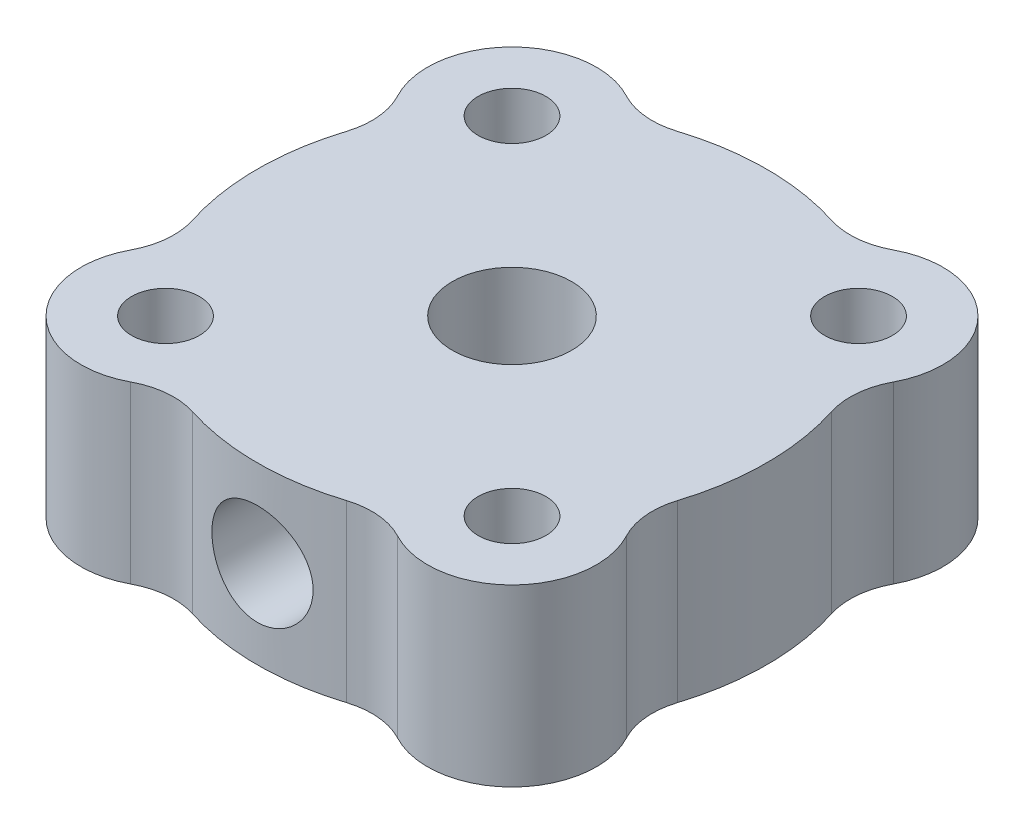
ISO-10303-21;
HEADER;
FILE_DESCRIPTION(('STEP AP214'),'2;1');
FILE_NAME('part.step','',(''),(''),'','','');
FILE_SCHEMA(('AUTOMOTIVE_DESIGN { 1 0 10303 214 1 1 1 1 }'));
ENDSEC;
DATA;
#1=APPLICATION_CONTEXT('core data for automotive mechanical design processes');
#2=APPLICATION_PROTOCOL_DEFINITION('international standard','automotive_design',2000,#1);
#3=PRODUCT_CONTEXT('',#1,'mechanical');
#4=PRODUCT('Part','Part','',(#3));
#5=PRODUCT_RELATED_PRODUCT_CATEGORY('part','',(#4));
#6=PRODUCT_DEFINITION_FORMATION('','',#4);
#7=PRODUCT_DEFINITION_CONTEXT('part definition',#1,'design');
#8=PRODUCT_DEFINITION('design','',#6,#7);
#9=PRODUCT_DEFINITION_SHAPE('','',#8);
#10=(LENGTH_UNIT() NAMED_UNIT(*) SI_UNIT(.MILLI.,.METRE.));
#11=(NAMED_UNIT(*) PLANE_ANGLE_UNIT() SI_UNIT($,.RADIAN.));
#12=(NAMED_UNIT(*) SI_UNIT($,.STERADIAN.) SOLID_ANGLE_UNIT());
#13=UNCERTAINTY_MEASURE_WITH_UNIT(LENGTH_MEASURE(1.E-05),#10,'distance_accuracy_value','');
#14=(GEOMETRIC_REPRESENTATION_CONTEXT(3) GLOBAL_UNCERTAINTY_ASSIGNED_CONTEXT((#13)) GLOBAL_UNIT_ASSIGNED_CONTEXT((#10,
#11,#12)) REPRESENTATION_CONTEXT('',''));
#15=CARTESIAN_POINT('',(0.,0.,0.));
#16=DIRECTION('',(0.,0.,1.));
#17=DIRECTION('',(1.,0.,0.));
#18=AXIS2_PLACEMENT_3D('',#15,#16,#17);
#19=CARTESIAN_POINT('',(0.,9.525,0.));
#20=DIRECTION('',(0.,-1.,0.));
#21=DIRECTION('',(0.,0.,-1.));
#22=AXIS2_PLACEMENT_3D('',#19,#20,#21);
#23=CYLINDRICAL_SURFACE('',#22,10.16);
#24=CARTESIAN_POINT('',(2.01929999999999,6.0325,9.95731025478267));
#25=CARTESIAN_POINT('',(2.01929583472054,6.14471648081074,9.95731248100948));
#26=CARTESIAN_POINT('',(2.00991409735292,6.25698558348416,9.95922785586349));
#27=CARTESIAN_POINT('',(1.97266569039373,6.47834882589701,9.96667132616414));
#28=CARTESIAN_POINT('',(1.94478413860136,6.58744033560093,9.97220233015554));
#29=CARTESIAN_POINT('',(1.87143393907439,6.79921376443675,9.98622645576942));
#30=CARTESIAN_POINT('',(1.82598266968648,6.90190190100549,9.99471664962022));
#31=CARTESIAN_POINT('',(1.71883064565229,7.09819202927756,10.0136990438493));
#32=CARTESIAN_POINT('',(1.65713083482633,7.19179454830025,10.0241911279352));
#33=CARTESIAN_POINT('',(1.51831456308946,7.3685688358573,10.0461588179763));
#34=CARTESIAN_POINT('',(1.44101465159409,7.4515952419108,10.0576450984735));
#35=CARTESIAN_POINT('',(1.27358880693613,7.60359171262718,10.0802129819397));
#36=CARTESIAN_POINT('',(1.1834619814265,7.67256079853317,10.0912945566865));
#37=CARTESIAN_POINT('',(0.991978888873635,7.79504818382441,10.1119194809288));
#38=CARTESIAN_POINT('',(0.890532687047899,7.84842845845371,10.1214487772059));
#39=CARTESIAN_POINT('',(0.679890278164236,7.93733244100311,10.1377755839567));
#40=CARTESIAN_POINT('',(0.570694788505186,7.97285779940727,10.144573346918));
#41=CARTESIAN_POINT('',(0.349161788437554,8.02459131793428,10.154595752293));
#42=CARTESIAN_POINT('',(0.236883675736461,8.04104489728259,10.1578657517424));
#43=CARTESIAN_POINT('',(0.0111162641446423,8.05493339468122,10.1606208068315));
#44=CARTESIAN_POINT('',(-0.102372918401157,8.05237012350486,10.1601062228371));
#45=CARTESIAN_POINT('',(-0.325654864980675,8.02848403665119,10.1553852675884));
#46=CARTESIAN_POINT('',(-0.435477167837939,8.00742556635269,10.1512309202276));
#47=CARTESIAN_POINT('',(-0.649997577271895,7.94756601948196,10.1397558615875));
#48=CARTESIAN_POINT('',(-0.754695480457813,7.90876423929733,10.1324350247414));
#49=CARTESIAN_POINT('',(-0.956750519015136,7.81427390243647,10.115363698157));
#50=CARTESIAN_POINT('',(-1.05405781450477,7.75848156506107,10.1055983441212));
#51=CARTESIAN_POINT('',(-1.23802703079321,7.63167061531241,10.0847148547401));
#52=CARTESIAN_POINT('',(-1.32468773944256,7.5606502717022,10.073596565645));
#53=CARTESIAN_POINT('',(-1.48647228733592,7.40394847765145,10.0510098074602));
#54=CARTESIAN_POINT('',(-1.56137184428112,7.31803568975991,10.0395386049798));
#55=CARTESIAN_POINT('',(-1.69573631850563,7.13475332435081,10.0177205902224));
#56=CARTESIAN_POINT('',(-1.75520095107537,7.03738353554782,10.0073737986882));
#57=CARTESIAN_POINT('',(-1.85708356820953,6.8336315693991,9.98897088276163));
#58=CARTESIAN_POINT('',(-1.89946562657724,6.72723096210058,9.98091959631615));
#59=CARTESIAN_POINT('',(-1.96568550088683,6.5086220273289,9.96809057436094));
#60=CARTESIAN_POINT('',(-1.98952570093373,6.39641444849336,9.96331241800282));
#61=CARTESIAN_POINT('',(-2.01765071256751,6.17140843575904,9.95765485692872));
#62=CARTESIAN_POINT('',(-2.02225923620202,6.05865204309633,9.95671092102642));
#63=CARTESIAN_POINT('',(-2.01266081032541,5.83398154987005,9.95865551443959));
#64=CARTESIAN_POINT('',(-1.99845491360724,5.72206740252961,9.96154382931495));
#65=CARTESIAN_POINT('',(-1.9519098538232,5.50334386399201,9.9707670861358));
#66=CARTESIAN_POINT('',(-1.91974332035685,5.39649622680081,9.97706919921533));
#67=CARTESIAN_POINT('',(-1.8383745157426,5.18970686678601,9.99238122747374));
#68=CARTESIAN_POINT('',(-1.78917085617849,5.08976570759246,10.0013913633312));
#69=CARTESIAN_POINT('',(-1.67439047681825,4.89820879855574,10.0212493996471));
#70=CARTESIAN_POINT('',(-1.60861100411642,4.80671688167348,10.0321194790247));
#71=CARTESIAN_POINT('',(-1.46281682517205,4.63595189402262,10.0544116075468));
#72=CARTESIAN_POINT('',(-1.38280067294784,4.55668006594381,10.0658337126731));
#73=CARTESIAN_POINT('',(-1.20935205961919,4.41137999346542,10.0881521334929));
#74=CARTESIAN_POINT('',(-1.1157347637329,4.34557050319768,10.0990378663506));
#75=CARTESIAN_POINT('',(-0.918584914987863,4.2306140237611,10.1188735848748));
#76=CARTESIAN_POINT('',(-0.815052775389772,4.1814663404987,10.1278236511712));
#77=CARTESIAN_POINT('',(-0.601590209450042,4.10154832702031,10.1427343861575));
#78=CARTESIAN_POINT('',(-0.491699699745443,4.07067464844154,10.1487118351069));
#79=CARTESIAN_POINT('',(-0.268161937832407,4.02785333570459,10.1570757707768));
#80=CARTESIAN_POINT('',(-0.154515133827768,4.01590345180838,10.1594626843532));
#81=CARTESIAN_POINT('',(0.071218868637973,4.01135516774449,10.160366680656));
#82=CARTESIAN_POINT('',(0.183299304290988,4.01842772547701,10.1589495647003));
#83=CARTESIAN_POINT('',(0.404640583995705,4.05099764153571,10.1525429134065));
#84=CARTESIAN_POINT('',(0.513901462580982,4.076494774089,10.147553421844));
#85=CARTESIAN_POINT('',(0.726300284646134,4.14504459279328,10.1345643086958));
#86=CARTESIAN_POINT('',(0.829451274843124,4.18805820414095,10.1265713900384));
#87=CARTESIAN_POINT('',(1.02711935747099,4.29037861536837,10.1084365292301));
#88=CARTESIAN_POINT('',(1.12163577727434,4.34968668313618,10.0982944198626));
#89=CARTESIAN_POINT('',(1.30097999243297,4.48402472973566,10.0767727481945));
#90=CARTESIAN_POINT('',(1.38562924278183,4.55929034816621,10.0653760311269));
#91=CARTESIAN_POINT('',(1.54120945598551,4.72292234556948,10.0427321652959));
#92=CARTESIAN_POINT('',(1.61213716788294,4.81129182041696,10.0314850525637));
#93=CARTESIAN_POINT('',(1.73897517405694,4.99974777416245,10.0102825040114));
#94=CARTESIAN_POINT('',(1.79471811460913,5.0999486430512,10.0003420421847));
#95=CARTESIAN_POINT('',(1.8884879094074,5.3084634845006,9.98306090497214));
#96=CARTESIAN_POINT('',(1.92653090182189,5.41676996163533,9.9757178628242));
#97=CARTESIAN_POINT('',(1.9764074815881,5.60985772686369,9.96593546165869));
#98=CARTESIAN_POINT('',(1.9924635204386,5.69353465815226,9.96272096935184));
#99=CARTESIAN_POINT('',(2.01391117975831,5.86229766646156,9.95840755723886));
#100=CARTESIAN_POINT('',(2.01930315936829,5.94738369592979,9.95730856618758));
#101=CARTESIAN_POINT('',(2.01929999999999,6.0325,9.95731025478267));
#102=B_SPLINE_CURVE_WITH_KNOTS('',3,(#24,#25,#26,#27,#28,#29,#30,#31,#32,#33,#34,#35,#36,#37,
#38,#39,#40,#41,#42,#43,#44,#45,#46,#47,#48,#49,#50,#51,#52,#53,#54,#55,#56,#57,#58,#59,#60,#61,
#62,#63,#64,#65,#66,#67,#68,#69,#70,#71,#72,#73,#74,#75,#76,#77,#78,#79,#80,#81,#82,#83,#84,#85,
#86,#87,#88,#89,#90,#91,#92,#93,#94,#95,#96,#97,#98,#99,#100,#101),.UNSPECIFIED.,.T.,.F.,(4,2,2,
2,2,2,2,2,2,2,2,2,2,2,2,2,2,2,2,2,2,2,2,2,2,2,2,2,2,2,2,2,2,2,2,2,2,2,4),(0.,0.336337808736557,
0.672946513450811,1.00922312424327,1.34548020622296,1.68594978664511,2.02644306455713,
2.36986554733131,2.7132562787593,3.05217734035293,3.39106613049666,3.72518871419504,
4.05932454870097,4.39554372167702,4.73180113892274,5.07384705743528,5.4158992848109,
5.75866717175792,6.10139097845218,6.43832211337239,6.77523439553347,7.10896282714314,
7.44271846187695,7.78077354311649,8.11886297933245,8.4620727237986,8.80526816915846,
9.14650365852408,9.4876985773743,9.82302977436588,10.1583568623126,10.4929399831352,
10.8275491455843,11.1674944347507,11.5075201666336,11.851154280325,12.1944744639631,
12.4495955937626,12.704708131528),.UNSPECIFIED.);
#103=CARTESIAN_POINT('',(2.01929999999999,6.0325,9.95731025478267));
#104=VERTEX_POINT('',#103);
#105=EDGE_CURVE('E328',#104,#104,#102,.T.);
#106=ORIENTED_EDGE('',*,*,#105,.F.);
#107=EDGE_LOOP('',(#106));
#108=FACE_BOUND('',#107,.T.);
#109=CARTESIAN_POINT('',(0.,2.54,0.));
#110=DIRECTION('',(0.,-1.,0.));
#111=DIRECTION('',(0.,0.,-1.));
#112=AXIS2_PLACEMENT_3D('',#109,#110,#111);
#113=CIRCLE('',#112,10.16);
#114=CARTESIAN_POINT('',(3.07207088405129,2.54,9.68441947064275));
#115=VERTEX_POINT('',#114);
#116=CARTESIAN_POINT('',(-3.0720708840515,2.54,9.68441947064268));
#117=VERTEX_POINT('',#116);
#118=EDGE_CURVE('E286',#115,#117,#113,.T.);
#119=ORIENTED_EDGE('',*,*,#118,.F.);
#120=DIRECTION('',(0.,-1.,0.));
#121=VECTOR('',#120,1.);
#122=CARTESIAN_POINT('',(3.07207088405129,9.525,9.68441947064275));
#123=LINE('',#122,#121);
#124=CARTESIAN_POINT('',(3.07207088405129,9.525,9.68441947064275));
#125=VERTEX_POINT('',#124);
#126=EDGE_CURVE('E190',#115,#125,#123,.F.);
#127=ORIENTED_EDGE('',*,*,#126,.T.);
#128=CARTESIAN_POINT('',(0.,9.525,0.));
#129=DIRECTION('',(0.,-1.,0.));
#130=DIRECTION('',(0.,0.,-1.));
#131=AXIS2_PLACEMENT_3D('',#128,#129,#130);
#132=CIRCLE('',#131,10.16);
#133=CARTESIAN_POINT('',(-3.0720708840515,9.525,9.68441947064268));
#134=VERTEX_POINT('',#133);
#135=EDGE_CURVE('E263',#125,#134,#132,.T.);
#136=ORIENTED_EDGE('',*,*,#135,.T.);
#137=DIRECTION('',(0.,-1.,0.));
#138=VECTOR('',#137,1.);
#139=CARTESIAN_POINT('',(-3.0720708840515,9.525,9.68441947064268));
#140=LINE('',#139,#138);
#141=EDGE_CURVE('E187',#134,#117,#140,.T.);
#142=ORIENTED_EDGE('',*,*,#141,.T.);
#143=EDGE_LOOP('',(#119,#127,#136,#142));
#144=FACE_BOUND('',#143,.T.);
#145=ADVANCED_FACE('F35',(#108,#144),#23,.T.);
#146=CARTESIAN_POINT('',(9.68441947064275,2.54,-3.07207088405128));
#147=VERTEX_POINT('',#146);
#148=CARTESIAN_POINT('',(9.68441947064269,2.54,3.07207088405146));
#149=VERTEX_POINT('',#148);
#150=EDGE_CURVE('E248',#147,#149,#113,.T.);
#151=ORIENTED_EDGE('',*,*,#150,.F.);
#152=DIRECTION('',(0.,-1.,0.));
#153=VECTOR('',#152,1.);
#154=CARTESIAN_POINT('',(9.68441947064275,9.525,-3.07207088405128));
#155=LINE('',#154,#153);
#156=CARTESIAN_POINT('',(9.68441947064275,9.525,-3.07207088405128));
#157=VERTEX_POINT('',#156);
#158=EDGE_CURVE('E185',#147,#157,#155,.F.);
#159=ORIENTED_EDGE('',*,*,#158,.T.);
#160=CARTESIAN_POINT('',(9.68441947064269,9.525,3.07207088405146));
#161=VERTEX_POINT('',#160);
#162=EDGE_CURVE('E261',#157,#161,#132,.T.);
#163=ORIENTED_EDGE('',*,*,#162,.T.);
#164=DIRECTION('',(0.,-1.,0.));
#165=VECTOR('',#164,1.);
#166=CARTESIAN_POINT('',(9.68441947064269,9.525,3.07207088405146));
#167=LINE('',#166,#165);
#168=EDGE_CURVE('E177',#161,#149,#167,.T.);
#169=ORIENTED_EDGE('',*,*,#168,.T.);
#170=EDGE_LOOP('',(#151,#159,#163,#169));
#171=FACE_BOUND('',#170,.T.);
#172=ADVANCED_FACE('F396',(#171),#23,.T.);
#173=CARTESIAN_POINT('',(-3.07207088405132,2.54,-9.68441947064274));
#174=VERTEX_POINT('',#173);
#175=CARTESIAN_POINT('',(3.07207088405138,2.54,-9.68441947064272));
#176=VERTEX_POINT('',#175);
#177=EDGE_CURVE('E155',#174,#176,#113,.T.);
#178=ORIENTED_EDGE('',*,*,#177,.F.);
#179=DIRECTION('',(0.,-1.,0.));
#180=VECTOR('',#179,1.);
#181=CARTESIAN_POINT('',(-3.07207088405132,9.525,-9.68441947064274));
#182=LINE('',#181,#180);
#183=CARTESIAN_POINT('',(-3.07207088405132,9.525,-9.68441947064274));
#184=VERTEX_POINT('',#183);
#185=EDGE_CURVE('E210',#174,#184,#182,.F.);
#186=ORIENTED_EDGE('',*,*,#185,.T.);
#187=CARTESIAN_POINT('',(3.07207088405138,9.525,-9.68441947064272));
#188=VERTEX_POINT('',#187);
#189=EDGE_CURVE('E259',#184,#188,#132,.T.);
#190=ORIENTED_EDGE('',*,*,#189,.T.);
#191=DIRECTION('',(0.,-1.,0.));
#192=VECTOR('',#191,1.);
#193=CARTESIAN_POINT('',(3.07207088405138,9.525,-9.68441947064272));
#194=LINE('',#193,#192);
#195=EDGE_CURVE('E208',#188,#176,#194,.T.);
#196=ORIENTED_EDGE('',*,*,#195,.T.);
#197=EDGE_LOOP('',(#178,#186,#190,#196));
#198=FACE_BOUND('',#197,.T.);
#199=ADVANCED_FACE('F272',(#198),#23,.T.);
#200=CARTESIAN_POINT('',(-9.68441947064275,9.525,3.07207088405127));
#201=VERTEX_POINT('',#200);
#202=CARTESIAN_POINT('',(-9.68441947064273,9.525,-3.07207088405135));
#203=VERTEX_POINT('',#202);
#204=EDGE_CURVE('E254',#201,#203,#132,.T.);
#205=ORIENTED_EDGE('',*,*,#204,.T.);
#206=DIRECTION('',(0.,-1.,0.));
#207=VECTOR('',#206,1.);
#208=CARTESIAN_POINT('',(-9.68441947064273,9.525,-3.07207088405135));
#209=LINE('',#208,#207);
#210=CARTESIAN_POINT('',(-9.68441947064273,2.54,-3.07207088405135));
#211=VERTEX_POINT('',#210);
#212=EDGE_CURVE('E213',#203,#211,#209,.T.);
#213=ORIENTED_EDGE('',*,*,#212,.T.);
#214=CARTESIAN_POINT('',(-9.68441947064275,2.54,3.07207088405127));
#215=VERTEX_POINT('',#214);
#216=EDGE_CURVE('E240',#215,#211,#113,.T.);
#217=ORIENTED_EDGE('',*,*,#216,.F.);
#218=DIRECTION('',(0.,-1.,0.));
#219=VECTOR('',#218,1.);
#220=CARTESIAN_POINT('',(-9.68441947064276,9.525,3.07207088405127));
#221=LINE('',#220,#219);
#222=EDGE_CURVE('E57',#215,#201,#221,.F.);
#223=ORIENTED_EDGE('',*,*,#222,.T.);
#224=EDGE_LOOP('',(#205,#213,#217,#223));
#225=FACE_BOUND('',#224,.T.);
#226=ADVANCED_FACE('F245',(#225),#23,.T.);
#227=CARTESIAN_POINT('',(-6.91479721322333,9.525,6.91479721322316));
#228=DIRECTION('',(0.,-1.,0.));
#229=DIRECTION('',(0.,0.,-1.));
#230=AXIS2_PLACEMENT_3D('',#227,#228,#229);
#231=CYLINDRICAL_SURFACE('',#230,3.37220278677669);
#232=CARTESIAN_POINT('',(-6.91479721322333,2.54,6.91479721322316));
#233=DIRECTION('',(0.,-1.,0.));
#234=DIRECTION('',(0.,0.,-1.));
#235=AXIS2_PLACEMENT_3D('',#232,#233,#234);
#236=CIRCLE('',#235,3.37220278677669);
#237=CARTESIAN_POINT('',(-5.32895061805783,2.54,9.89084193932296));
#238=VERTEX_POINT('',#237);
#239=CARTESIAN_POINT('',(-9.89084193932309,2.54,5.32895061805759));
#240=VERTEX_POINT('',#239);
#241=EDGE_CURVE('E242',#238,#240,#236,.T.);
#242=ORIENTED_EDGE('',*,*,#241,.F.);
#243=DIRECTION('',(0.,-1.,0.));
#244=VECTOR('',#243,1.);
#245=CARTESIAN_POINT('',(-5.32895061805783,9.525,9.89084193932296));
#246=LINE('',#245,#244);
#247=CARTESIAN_POINT('',(-5.32895061805783,9.525,9.89084193932296));
#248=VERTEX_POINT('',#247);
#249=EDGE_CURVE('E201',#238,#248,#246,.F.);
#250=ORIENTED_EDGE('',*,*,#249,.T.);
#251=CARTESIAN_POINT('',(-6.91479721322333,9.525,6.91479721322316));
#252=DIRECTION('',(0.,-1.,0.));
#253=DIRECTION('',(0.,0.,-1.));
#254=AXIS2_PLACEMENT_3D('',#251,#252,#253);
#255=CIRCLE('',#254,3.37220278677669);
#256=CARTESIAN_POINT('',(-9.89084193932309,9.525,5.32895061805759));
#257=VERTEX_POINT('',#256);
#258=EDGE_CURVE('E180',#248,#257,#255,.T.);
#259=ORIENTED_EDGE('',*,*,#258,.T.);
#260=DIRECTION('',(0.,-1.,0.));
#261=VECTOR('',#260,1.);
#262=CARTESIAN_POINT('',(-9.89084193932309,9.525,5.32895061805759));
#263=LINE('',#262,#261);
#264=EDGE_CURVE('E198',#257,#240,#263,.T.);
#265=ORIENTED_EDGE('',*,*,#264,.T.);
#266=EDGE_LOOP('',(#242,#250,#259,#265));
#267=FACE_BOUND('',#266,.T.);
#268=ADVANCED_FACE('F256',(#267),#231,.T.);
#269=CARTESIAN_POINT('',(-3.45739860661167,9.525,3.45739860661158));
#270=DIRECTION('',(0.,-1.,0.));
#271=DIRECTION('',(0.,0.,-1.));
#272=AXIS2_PLACEMENT_3D('',#269,#270,#271);
#273=PLANE('',#272);
#274=CARTESIAN_POINT('',(0.,9.52500000000001,0.));
#275=DIRECTION('',(0.,-1.,0.));
#276=DIRECTION('',(0.,0.,-1.));
#277=AXIS2_PLACEMENT_3D('',#274,#275,#276);
#278=CIRCLE('',#277,2.38124999999998);
#279=CARTESIAN_POINT('',(0.,9.52500000000001,-2.38124999999998));
#280=VERTEX_POINT('',#279);
#281=EDGE_CURVE('E322',#280,#280,#278,.T.);
#282=ORIENTED_EDGE('',*,*,#281,.T.);
#283=EDGE_LOOP('',(#282));
#284=FACE_BOUND('',#283,.T.);
#285=CARTESIAN_POINT('',(6.91479721322318,9.52500000000001,-6.91479721322331));
#286=DIRECTION('',(0.,-1.,0.));
#287=DIRECTION('',(0.,0.,-1.));
#288=AXIS2_PLACEMENT_3D('',#285,#286,#287);
#289=CIRCLE('',#288,1.35254999999998);
#290=CARTESIAN_POINT('',(6.91479721322318,9.52500000000001,-8.26734721322329));
#291=VERTEX_POINT('',#290);
#292=EDGE_CURVE('E316',#291,#291,#289,.T.);
#293=ORIENTED_EDGE('',*,*,#292,.T.);
#294=EDGE_LOOP('',(#293));
#295=FACE_BOUND('',#294,.T.);
#296=CARTESIAN_POINT('',(6.91479721322324,9.52500000000001,6.91479721322326));
#297=DIRECTION('',(0.,-1.,0.));
#298=DIRECTION('',(0.,0.,-1.));
#299=AXIS2_PLACEMENT_3D('',#296,#297,#298);
#300=CIRCLE('',#299,1.35254999999998);
#301=CARTESIAN_POINT('',(6.91479721322324,9.52500000000001,5.56224721322328));
#302=VERTEX_POINT('',#301);
#303=EDGE_CURVE('E310',#302,#302,#300,.T.);
#304=ORIENTED_EDGE('',*,*,#303,.T.);
#305=EDGE_LOOP('',(#304));
#306=FACE_BOUND('',#305,.T.);
#307=CARTESIAN_POINT('',(-6.91479721322323,9.52500000000001,6.91479721322326));
#308=DIRECTION('',(0.,-1.,0.));
#309=DIRECTION('',(0.,0.,-1.));
#310=AXIS2_PLACEMENT_3D('',#307,#308,#309);
#311=CIRCLE('',#310,1.35254999999998);
#312=CARTESIAN_POINT('',(-6.91479721322323,9.52500000000001,5.56224721322328));
#313=VERTEX_POINT('',#312);
#314=EDGE_CURVE('E304',#313,#313,#311,.T.);
#315=ORIENTED_EDGE('',*,*,#314,.T.);
#316=EDGE_LOOP('',(#315));
#317=FACE_BOUND('',#316,.T.);
#318=CARTESIAN_POINT('',(-6.91479721322324,9.52500000000001,-6.91479721322326));
#319=DIRECTION('',(0.,-1.,0.));
#320=DIRECTION('',(0.,0.,-1.));
#321=AXIS2_PLACEMENT_3D('',#318,#319,#320);
#322=CIRCLE('',#321,1.35254999999998);
#323=CARTESIAN_POINT('',(-6.91479721322324,9.52500000000001,-8.26734721322324));
#324=VERTEX_POINT('',#323);
#325=EDGE_CURVE('E298',#324,#324,#322,.T.);
#326=ORIENTED_EDGE('',*,*,#325,.T.);
#327=EDGE_LOOP('',(#326));
#328=FACE_BOUND('',#327,.T.);
#329=ORIENTED_EDGE('',*,*,#204,.F.);
#330=CARTESIAN_POINT('',(-12.4686900684525,9.525,3.95529126321601));
#331=DIRECTION('',(0.,-1.,0.));
#332=DIRECTION('',(0.,0.,-1.));
#333=AXIS2_PLACEMENT_3D('',#330,#331,#332);
#334=CIRCLE('',#333,2.921);
#335=EDGE_CURVE('E11',#201,#257,#334,.T.);
#336=ORIENTED_EDGE('',*,*,#335,.T.);
#337=ORIENTED_EDGE('',*,*,#258,.F.);
#338=CARTESIAN_POINT('',(-3.95529126321631,9.525,12.4686900684524));
#339=DIRECTION('',(0.,-1.,0.));
#340=DIRECTION('',(0.,0.,-1.));
#341=AXIS2_PLACEMENT_3D('',#338,#339,#340);
#342=CIRCLE('',#341,2.921);
#343=EDGE_CURVE('E226',#248,#134,#342,.T.);
#344=ORIENTED_EDGE('',*,*,#343,.T.);
#345=ORIENTED_EDGE('',*,*,#135,.F.);
#346=CARTESIAN_POINT('',(3.95529126321603,9.525,12.4686900684525));
#347=DIRECTION('',(0.,-1.,0.));
#348=DIRECTION('',(0.,0.,-1.));
#349=AXIS2_PLACEMENT_3D('',#346,#347,#348);
#350=CIRCLE('',#349,2.921);
#351=CARTESIAN_POINT('',(5.32895061805761,9.525,9.89084193932309));
#352=VERTEX_POINT('',#351);
#353=EDGE_CURVE('E220',#125,#352,#350,.T.);
#354=ORIENTED_EDGE('',*,*,#353,.T.);
#355=CARTESIAN_POINT('',(6.91479721322319,9.525,6.91479721322331));
#356=DIRECTION('',(0.,1.,0.));
#357=DIRECTION('',(0.,0.,1.));
#358=AXIS2_PLACEMENT_3D('',#355,#356,#357);
#359=CIRCLE('',#358,3.3722027867767);
#360=CARTESIAN_POINT('',(9.89084193932299,9.525,5.32895061805778));
#361=VERTEX_POINT('',#360);
#362=EDGE_CURVE('E290',#352,#361,#359,.T.);
#363=ORIENTED_EDGE('',*,*,#362,.T.);
#364=CARTESIAN_POINT('',(12.4686900684525,9.525,3.95529126321625));
#365=DIRECTION('',(0.,-1.,0.));
#366=DIRECTION('',(0.,0.,-1.));
#367=AXIS2_PLACEMENT_3D('',#364,#365,#366);
#368=CIRCLE('',#367,2.921);
#369=EDGE_CURVE('E232',#361,#161,#368,.T.);
#370=ORIENTED_EDGE('',*,*,#369,.T.);
#371=ORIENTED_EDGE('',*,*,#162,.F.);
#372=CARTESIAN_POINT('',(12.4686900684525,9.525,-3.95529126321603));
#373=DIRECTION('',(0.,-1.,0.));
#374=DIRECTION('',(0.,0.,-1.));
#375=AXIS2_PLACEMENT_3D('',#372,#373,#374);
#376=CIRCLE('',#375,2.921);
#377=CARTESIAN_POINT('',(9.89084193932309,9.525,-5.32895061805761));
#378=VERTEX_POINT('',#377);
#379=EDGE_CURVE('E218',#157,#378,#376,.T.);
#380=ORIENTED_EDGE('',*,*,#379,.T.);
#381=CARTESIAN_POINT('',(6.91479721322328,9.525,-6.91479721322321));
#382=DIRECTION('',(0.,-1.,0.));
#383=DIRECTION('',(0.,0.,-1.));
#384=AXIS2_PLACEMENT_3D('',#381,#382,#383);
#385=CIRCLE('',#384,3.37220278677674);
#386=CARTESIAN_POINT('',(5.32895061805771,9.525,-9.89084193932303));
#387=VERTEX_POINT('',#386);
#388=EDGE_CURVE('E170',#387,#378,#385,.T.);
#389=ORIENTED_EDGE('',*,*,#388,.F.);
#390=CARTESIAN_POINT('',(3.95529126321616,9.525,-12.4686900684525));
#391=DIRECTION('',(0.,-1.,0.));
#392=DIRECTION('',(0.,0.,-1.));
#393=AXIS2_PLACEMENT_3D('',#390,#391,#392);
#394=CIRCLE('',#393,2.921);
#395=EDGE_CURVE('E160',#387,#188,#394,.T.);
#396=ORIENTED_EDGE('',*,*,#395,.T.);
#397=ORIENTED_EDGE('',*,*,#189,.F.);
#398=CARTESIAN_POINT('',(-3.95529126321607,9.525,-12.4686900684525));
#399=DIRECTION('',(0.,-1.,0.));
#400=DIRECTION('',(0.,0.,-1.));
#401=AXIS2_PLACEMENT_3D('',#398,#399,#400);
#402=CIRCLE('',#401,2.921);
#403=CARTESIAN_POINT('',(-5.32895061805764,9.525,-9.89084193932307));
#404=VERTEX_POINT('',#403);
#405=EDGE_CURVE('E230',#184,#404,#402,.T.);
#406=ORIENTED_EDGE('',*,*,#405,.T.);
#407=CARTESIAN_POINT('',(-6.91479721322324,9.525,-6.91479721322326));
#408=DIRECTION('',(0.,-1.,0.));
#409=DIRECTION('',(0.,0.,-1.));
#410=AXIS2_PLACEMENT_3D('',#407,#408,#409);
#411=CIRCLE('',#410,3.37220278677674);
#412=CARTESIAN_POINT('',(-9.89084193932305,9.525,-5.32895061805768));
#413=VERTEX_POINT('',#412);
#414=EDGE_CURVE('E285',#413,#404,#411,.T.);
#415=ORIENTED_EDGE('',*,*,#414,.F.);
#416=CARTESIAN_POINT('',(-12.4686900684525,9.525,-3.95529126321611));
#417=DIRECTION('',(0.,-1.,0.));
#418=DIRECTION('',(0.,0.,-1.));
#419=AXIS2_PLACEMENT_3D('',#416,#417,#418);
#420=CIRCLE('',#419,2.921);
#421=EDGE_CURVE('E50',#413,#203,#420,.T.);
#422=ORIENTED_EDGE('',*,*,#421,.T.);
#423=EDGE_LOOP('',(#329,#336,#337,#344,#345,#354,#363,#370,#371,#380,#389,#396,#397,#406,#415,#422));
#424=FACE_BOUND('',#423,.T.);
#425=ADVANCED_FACE('F252',(#284,#295,#306,#317,#328,#424),#273,.F.);
#426=CARTESIAN_POINT('',(-3.45739860661167,2.54,3.45739860661158));
#427=DIRECTION('',(0.,-1.,0.));
#428=DIRECTION('',(0.,0.,-1.));
#429=AXIS2_PLACEMENT_3D('',#426,#427,#428);
#430=PLANE('',#429);
#431=CARTESIAN_POINT('',(6.91479721322318,2.54,-6.91479721322331));
#432=DIRECTION('',(0.,-1.,0.));
#433=DIRECTION('',(0.,0.,-1.));
#434=AXIS2_PLACEMENT_3D('',#431,#432,#433);
#435=CIRCLE('',#434,1.35254999999998);
#436=CARTESIAN_POINT('',(6.91479721322318,2.54,-8.26734721322329));
#437=VERTEX_POINT('',#436);
#438=EDGE_CURVE('E319',#437,#437,#435,.T.);
#439=ORIENTED_EDGE('',*,*,#438,.F.);
#440=EDGE_LOOP('',(#439));
#441=FACE_BOUND('',#440,.T.);
#442=CARTESIAN_POINT('',(6.91479721322324,2.54,6.91479721322326));
#443=DIRECTION('',(0.,-1.,0.));
#444=DIRECTION('',(0.,0.,-1.));
#445=AXIS2_PLACEMENT_3D('',#442,#443,#444);
#446=CIRCLE('',#445,1.35254999999998);
#447=CARTESIAN_POINT('',(6.91479721322324,2.54,5.56224721322328));
#448=VERTEX_POINT('',#447);
#449=EDGE_CURVE('E313',#448,#448,#446,.T.);
#450=ORIENTED_EDGE('',*,*,#449,.F.);
#451=EDGE_LOOP('',(#450));
#452=FACE_BOUND('',#451,.T.);
#453=CARTESIAN_POINT('',(-6.91479721322323,2.54,6.91479721322326));
#454=DIRECTION('',(0.,-1.,0.));
#455=DIRECTION('',(0.,0.,-1.));
#456=AXIS2_PLACEMENT_3D('',#453,#454,#455);
#457=CIRCLE('',#456,1.35254999999998);
#458=CARTESIAN_POINT('',(-6.91479721322323,2.54,5.56224721322328));
#459=VERTEX_POINT('',#458);
#460=EDGE_CURVE('E307',#459,#459,#457,.T.);
#461=ORIENTED_EDGE('',*,*,#460,.F.);
#462=EDGE_LOOP('',(#461));
#463=FACE_BOUND('',#462,.T.);
#464=CARTESIAN_POINT('',(-6.91479721322324,2.54,-6.91479721322326));
#465=DIRECTION('',(0.,-1.,0.));
#466=DIRECTION('',(0.,0.,-1.));
#467=AXIS2_PLACEMENT_3D('',#464,#465,#466);
#468=CIRCLE('',#467,1.35254999999998);
#469=CARTESIAN_POINT('',(-6.91479721322324,2.54,-8.26734721322324));
#470=VERTEX_POINT('',#469);
#471=EDGE_CURVE('E301',#470,#470,#468,.T.);
#472=ORIENTED_EDGE('',*,*,#471,.F.);
#473=EDGE_LOOP('',(#472));
#474=FACE_BOUND('',#473,.T.);
#475=CARTESIAN_POINT('',(0.,2.54,0.));
#476=DIRECTION('',(0.,-1.,0.));
#477=DIRECTION('',(0.,0.,-1.));
#478=AXIS2_PLACEMENT_3D('',#475,#476,#477);
#479=CIRCLE('',#478,6.35);
#480=CARTESIAN_POINT('',(0.,2.54,-6.35));
#481=VERTEX_POINT('',#480);
#482=EDGE_CURVE('E175',#481,#481,#479,.T.);
#483=ORIENTED_EDGE('',*,*,#482,.F.);
#484=EDGE_LOOP('',(#483));
#485=FACE_BOUND('',#484,.T.);
#486=ORIENTED_EDGE('',*,*,#241,.T.);
#487=CARTESIAN_POINT('',(-12.4686900684525,2.54,3.95529126321601));
#488=DIRECTION('',(0.,-1.,0.));
#489=DIRECTION('',(0.,0.,-1.));
#490=AXIS2_PLACEMENT_3D('',#487,#488,#489);
#491=CIRCLE('',#490,2.921);
#492=EDGE_CURVE('E43',#240,#215,#491,.F.);
#493=ORIENTED_EDGE('',*,*,#492,.T.);
#494=ORIENTED_EDGE('',*,*,#216,.T.);
#495=CARTESIAN_POINT('',(-12.4686900684525,2.54,-3.95529126321611));
#496=DIRECTION('',(0.,-1.,0.));
#497=DIRECTION('',(0.,0.,-1.));
#498=AXIS2_PLACEMENT_3D('',#495,#496,#497);
#499=CIRCLE('',#498,2.921);
#500=CARTESIAN_POINT('',(-9.89084193932305,2.54,-5.32895061805768));
#501=VERTEX_POINT('',#500);
#502=EDGE_CURVE('E236',#211,#501,#499,.F.);
#503=ORIENTED_EDGE('',*,*,#502,.T.);
#504=CARTESIAN_POINT('',(-6.91479721322324,2.54,-6.91479721322326));
#505=DIRECTION('',(0.,-1.,0.));
#506=DIRECTION('',(0.,0.,-1.));
#507=AXIS2_PLACEMENT_3D('',#504,#505,#506);
#508=CIRCLE('',#507,3.37220278677674);
#509=CARTESIAN_POINT('',(-5.32895061805764,2.54,-9.89084193932307));
#510=VERTEX_POINT('',#509);
#511=EDGE_CURVE('E283',#501,#510,#508,.T.);
#512=ORIENTED_EDGE('',*,*,#511,.T.);
#513=CARTESIAN_POINT('',(-3.95529126321607,2.54,-12.4686900684525));
#514=DIRECTION('',(0.,-1.,0.));
#515=DIRECTION('',(0.,0.,-1.));
#516=AXIS2_PLACEMENT_3D('',#513,#514,#515);
#517=CIRCLE('',#516,2.921);
#518=EDGE_CURVE('E228',#510,#174,#517,.F.);
#519=ORIENTED_EDGE('',*,*,#518,.T.);
#520=ORIENTED_EDGE('',*,*,#177,.T.);
#521=CARTESIAN_POINT('',(3.95529126321616,2.54,-12.4686900684525));
#522=DIRECTION('',(0.,-1.,0.));
#523=DIRECTION('',(0.,0.,-1.));
#524=AXIS2_PLACEMENT_3D('',#521,#522,#523);
#525=CIRCLE('',#524,2.921);
#526=CARTESIAN_POINT('',(5.32895061805771,2.54,-9.89084193932303));
#527=VERTEX_POINT('',#526);
#528=EDGE_CURVE('E149',#176,#527,#525,.F.);
#529=ORIENTED_EDGE('',*,*,#528,.T.);
#530=CARTESIAN_POINT('',(6.91479721322328,2.54,-6.91479721322321));
#531=DIRECTION('',(0.,-1.,0.));
#532=DIRECTION('',(0.,0.,-1.));
#533=AXIS2_PLACEMENT_3D('',#530,#531,#532);
#534=CIRCLE('',#533,3.37220278677674);
#535=CARTESIAN_POINT('',(9.89084193932309,2.54,-5.32895061805761));
#536=VERTEX_POINT('',#535);
#537=EDGE_CURVE('E153',#527,#536,#534,.T.);
#538=ORIENTED_EDGE('',*,*,#537,.T.);
#539=CARTESIAN_POINT('',(12.4686900684525,2.54,-3.95529126321603));
#540=DIRECTION('',(0.,-1.,0.));
#541=DIRECTION('',(0.,0.,-1.));
#542=AXIS2_PLACEMENT_3D('',#539,#540,#541);
#543=CIRCLE('',#542,2.921);
#544=EDGE_CURVE('E216',#536,#147,#543,.F.);
#545=ORIENTED_EDGE('',*,*,#544,.T.);
#546=ORIENTED_EDGE('',*,*,#150,.T.);
#547=CARTESIAN_POINT('',(12.4686900684525,2.54,3.95529126321625));
#548=DIRECTION('',(0.,-1.,0.));
#549=DIRECTION('',(0.,0.,-1.));
#550=AXIS2_PLACEMENT_3D('',#547,#548,#549);
#551=CIRCLE('',#550,2.921);
#552=CARTESIAN_POINT('',(9.89084193932299,2.54,5.32895061805778));
#553=VERTEX_POINT('',#552);
#554=EDGE_CURVE('E234',#149,#553,#551,.F.);
#555=ORIENTED_EDGE('',*,*,#554,.T.);
#556=CARTESIAN_POINT('',(6.91479721322319,2.54,6.91479721322331));
#557=DIRECTION('',(0.,1.,0.));
#558=DIRECTION('',(0.,0.,1.));
#559=AXIS2_PLACEMENT_3D('',#556,#557,#558);
#560=CIRCLE('',#559,3.3722027867767);
#561=CARTESIAN_POINT('',(5.32895061805761,2.54,9.89084193932309));
#562=VERTEX_POINT('',#561);
#563=EDGE_CURVE('E171',#562,#553,#560,.T.);
#564=ORIENTED_EDGE('',*,*,#563,.F.);
#565=CARTESIAN_POINT('',(3.95529126321603,2.54,12.4686900684525));
#566=DIRECTION('',(0.,-1.,0.));
#567=DIRECTION('',(0.,0.,-1.));
#568=AXIS2_PLACEMENT_3D('',#565,#566,#567);
#569=CIRCLE('',#568,2.921);
#570=EDGE_CURVE('E222',#562,#115,#569,.F.);
#571=ORIENTED_EDGE('',*,*,#570,.T.);
#572=ORIENTED_EDGE('',*,*,#118,.T.);
#573=CARTESIAN_POINT('',(-3.95529126321631,2.54,12.4686900684524));
#574=DIRECTION('',(0.,-1.,0.));
#575=DIRECTION('',(0.,0.,-1.));
#576=AXIS2_PLACEMENT_3D('',#573,#574,#575);
#577=CIRCLE('',#576,2.921);
#578=EDGE_CURVE('E224',#117,#238,#577,.F.);
#579=ORIENTED_EDGE('',*,*,#578,.T.);
#580=EDGE_LOOP('',(#486,#493,#494,#503,#512,#519,#520,#529,#538,#545,#546,#555,#564,#571,#572,#579));
#581=FACE_BOUND('',#580,.T.);
#582=ADVANCED_FACE('F152',(#441,#452,#463,#474,#485,#581),#430,.T.);
#583=CARTESIAN_POINT('',(-6.91479721322324,9.525,-6.91479721322326));
#584=DIRECTION('',(0.,-1.,0.));
#585=DIRECTION('',(0.,0.,-1.));
#586=AXIS2_PLACEMENT_3D('',#583,#584,#585);
#587=CYLINDRICAL_SURFACE('',#586,3.37220278677674);
#588=ORIENTED_EDGE('',*,*,#414,.T.);
#589=DIRECTION('',(0.,-1.,0.));
#590=VECTOR('',#589,1.);
#591=CARTESIAN_POINT('',(-5.32895061805764,9.525,-9.89084193932307));
#592=LINE('',#591,#590);
#593=EDGE_CURVE('E205',#404,#510,#592,.T.);
#594=ORIENTED_EDGE('',*,*,#593,.T.);
#595=ORIENTED_EDGE('',*,*,#511,.F.);
#596=DIRECTION('',(0.,-1.,0.));
#597=VECTOR('',#596,1.);
#598=CARTESIAN_POINT('',(-9.89084193932305,9.525,-5.32895061805768));
#599=LINE('',#598,#597);
#600=EDGE_CURVE('E203',#501,#413,#599,.F.);
#601=ORIENTED_EDGE('',*,*,#600,.T.);
#602=EDGE_LOOP('',(#588,#594,#595,#601));
#603=FACE_BOUND('',#602,.T.);
#604=ADVANCED_FACE('F282',(#603),#587,.T.);
#605=CARTESIAN_POINT('',(6.91479721322328,9.525,-6.91479721322321));
#606=DIRECTION('',(0.,-1.,0.));
#607=DIRECTION('',(0.,0.,-1.));
#608=AXIS2_PLACEMENT_3D('',#605,#606,#607);
#609=CYLINDRICAL_SURFACE('',#608,3.37220278677674);
#610=ORIENTED_EDGE('',*,*,#388,.T.);
#611=DIRECTION('',(0.,-1.,0.));
#612=VECTOR('',#611,1.);
#613=CARTESIAN_POINT('',(9.89084193932309,9.525,-5.32895061805761));
#614=LINE('',#613,#612);
#615=EDGE_CURVE('E169',#378,#536,#614,.T.);
#616=ORIENTED_EDGE('',*,*,#615,.T.);
#617=ORIENTED_EDGE('',*,*,#537,.F.);
#618=DIRECTION('',(0.,-1.,0.));
#619=VECTOR('',#618,1.);
#620=CARTESIAN_POINT('',(5.32895061805771,9.525,-9.89084193932303));
#621=LINE('',#620,#619);
#622=EDGE_CURVE('E166',#527,#387,#621,.F.);
#623=ORIENTED_EDGE('',*,*,#622,.T.);
#624=EDGE_LOOP('',(#610,#616,#617,#623));
#625=FACE_BOUND('',#624,.T.);
#626=ADVANCED_FACE('F165',(#625),#609,.T.);
#627=CARTESIAN_POINT('',(6.91479721322319,2.54,6.91479721322331));
#628=DIRECTION('',(0.,1.,0.));
#629=DIRECTION('',(0.,0.,1.));
#630=AXIS2_PLACEMENT_3D('',#627,#628,#629);
#631=CYLINDRICAL_SURFACE('',#630,3.3722027867767);
#632=ORIENTED_EDGE('',*,*,#362,.F.);
#633=DIRECTION('',(0.,1.,0.));
#634=VECTOR('',#633,1.);
#635=CARTESIAN_POINT('',(5.32895061805761,2.54,9.89084193932309));
#636=LINE('',#635,#634);
#637=EDGE_CURVE('E196',#352,#562,#636,.F.);
#638=ORIENTED_EDGE('',*,*,#637,.T.);
#639=ORIENTED_EDGE('',*,*,#563,.T.);
#640=DIRECTION('',(0.,1.,0.));
#641=VECTOR('',#640,1.);
#642=CARTESIAN_POINT('',(9.89084193932299,2.54,5.32895061805778));
#643=LINE('',#642,#641);
#644=EDGE_CURVE('E193',#553,#361,#643,.T.);
#645=ORIENTED_EDGE('',*,*,#644,.T.);
#646=EDGE_LOOP('',(#632,#638,#639,#645));
#647=FACE_BOUND('',#646,.T.);
#648=ADVANCED_FACE('F377',(#647),#631,.T.);
#649=CARTESIAN_POINT('',(0.,2.54,0.));
#650=DIRECTION('',(0.,-1.,0.));
#651=DIRECTION('',(0.,0.,-1.));
#652=AXIS2_PLACEMENT_3D('',#649,#650,#651);
#653=CYLINDRICAL_SURFACE('',#652,6.35);
#654=ORIENTED_EDGE('',*,*,#482,.T.);
#655=EDGE_LOOP('',(#654));
#656=FACE_BOUND('',#655,.T.);
#657=CARTESIAN_POINT('',(0.,0.,0.));
#658=DIRECTION('',(0.,-1.,0.));
#659=DIRECTION('',(0.,0.,-1.));
#660=AXIS2_PLACEMENT_3D('',#657,#658,#659);
#661=CIRCLE('',#660,6.35);
#662=CARTESIAN_POINT('',(0.,0.,-6.35));
#663=VERTEX_POINT('',#662);
#664=EDGE_CURVE('E293',#663,#663,#661,.T.);
#665=ORIENTED_EDGE('',*,*,#664,.F.);
#666=EDGE_LOOP('',(#665));
#667=FACE_BOUND('',#666,.T.);
#668=ADVANCED_FACE('F373',(#656,#667),#653,.T.);
#669=CARTESIAN_POINT('',(0.,0.,0.));
#670=DIRECTION('',(0.,-1.,0.));
#671=DIRECTION('',(0.,0.,-1.));
#672=AXIS2_PLACEMENT_3D('',#669,#670,#671);
#673=PLANE('',#672);
#674=CARTESIAN_POINT('',(0.,0.,0.));
#675=DIRECTION('',(0.,-1.,0.));
#676=DIRECTION('',(0.,0.,-1.));
#677=AXIS2_PLACEMENT_3D('',#674,#675,#676);
#678=CIRCLE('',#677,2.38124999999999);
#679=CARTESIAN_POINT('',(0.,0.,-2.38124999999999));
#680=VERTEX_POINT('',#679);
#681=EDGE_CURVE('E325',#680,#680,#678,.T.);
#682=ORIENTED_EDGE('',*,*,#681,.F.);
#683=EDGE_LOOP('',(#682));
#684=FACE_BOUND('',#683,.T.);
#685=ORIENTED_EDGE('',*,*,#664,.T.);
#686=EDGE_LOOP('',(#685));
#687=FACE_BOUND('',#686,.T.);
#688=ADVANCED_FACE('F369',(#684,#687),#673,.T.);
#689=CARTESIAN_POINT('',(-6.91479721322324,2.54,-6.91479721322326));
#690=DIRECTION('',(0.,-1.,0.));
#691=DIRECTION('',(0.,0.,-1.));
#692=AXIS2_PLACEMENT_3D('',#689,#690,#691);
#693=CYLINDRICAL_SURFACE('',#692,1.35254999999998);
#694=ORIENTED_EDGE('',*,*,#325,.F.);
#695=EDGE_LOOP('',(#694));
#696=FACE_BOUND('',#695,.T.);
#697=ORIENTED_EDGE('',*,*,#471,.T.);
#698=EDGE_LOOP('',(#697));
#699=FACE_BOUND('',#698,.T.);
#700=ADVANCED_FACE('F365',(#696,#699),#693,.F.);
#701=CARTESIAN_POINT('',(-6.91479721322323,2.54,6.91479721322326));
#702=DIRECTION('',(0.,-1.,0.));
#703=DIRECTION('',(0.,0.,-1.));
#704=AXIS2_PLACEMENT_3D('',#701,#702,#703);
#705=CYLINDRICAL_SURFACE('',#704,1.35254999999998);
#706=ORIENTED_EDGE('',*,*,#314,.F.);
#707=EDGE_LOOP('',(#706));
#708=FACE_BOUND('',#707,.T.);
#709=ORIENTED_EDGE('',*,*,#460,.T.);
#710=EDGE_LOOP('',(#709));
#711=FACE_BOUND('',#710,.T.);
#712=ADVANCED_FACE('F361',(#708,#711),#705,.F.);
#713=CARTESIAN_POINT('',(6.91479721322324,2.54,6.91479721322326));
#714=DIRECTION('',(0.,-1.,0.));
#715=DIRECTION('',(0.,0.,-1.));
#716=AXIS2_PLACEMENT_3D('',#713,#714,#715);
#717=CYLINDRICAL_SURFACE('',#716,1.35254999999998);
#718=ORIENTED_EDGE('',*,*,#303,.F.);
#719=EDGE_LOOP('',(#718));
#720=FACE_BOUND('',#719,.T.);
#721=ORIENTED_EDGE('',*,*,#449,.T.);
#722=EDGE_LOOP('',(#721));
#723=FACE_BOUND('',#722,.T.);
#724=ADVANCED_FACE('F357',(#720,#723),#717,.F.);
#725=CARTESIAN_POINT('',(6.91479721322318,2.54,-6.91479721322331));
#726=DIRECTION('',(0.,-1.,0.));
#727=DIRECTION('',(0.,0.,-1.));
#728=AXIS2_PLACEMENT_3D('',#725,#726,#727);
#729=CYLINDRICAL_SURFACE('',#728,1.35254999999998);
#730=ORIENTED_EDGE('',*,*,#292,.F.);
#731=EDGE_LOOP('',(#730));
#732=FACE_BOUND('',#731,.T.);
#733=ORIENTED_EDGE('',*,*,#438,.T.);
#734=EDGE_LOOP('',(#733));
#735=FACE_BOUND('',#734,.T.);
#736=ADVANCED_FACE('F353',(#732,#735),#729,.F.);
#737=CARTESIAN_POINT('',(0.,0.,0.));
#738=DIRECTION('',(0.,-1.,0.));
#739=DIRECTION('',(0.,0.,-1.));
#740=AXIS2_PLACEMENT_3D('',#737,#738,#739);
#741=CYLINDRICAL_SURFACE('',#740,2.38124999999998);
#742=CARTESIAN_POINT('',(2.01929999999999,6.0325,1.26205351411894));
#743=CARTESIAN_POINT('',(2.01929069614341,6.10167682715141,1.26207834818193));
#744=CARTESIAN_POINT('',(2.01569819232827,6.17096296972695,1.26787264236478));
#745=CARTESIAN_POINT('',(2.0017074615824,6.30724655074318,1.2898329535887));
#746=CARTESIAN_POINT('',(1.99128374013323,6.37423442243879,1.30603781902954));
#747=CARTESIAN_POINT('',(1.95902417177263,6.53105918604544,1.35414211371877));
#748=CARTESIAN_POINT('',(1.93427214745227,6.61911941242919,1.38974330080965));
#749=CARTESIAN_POINT('',(1.87479805373405,6.78799624754555,1.46899601890633));
#750=CARTESIAN_POINT('',(1.84004287962899,6.86878761561711,1.51267410535374));
#751=CARTESIAN_POINT('',(1.77145888388123,7.00393068181737,1.59194922541476));
#752=CARTESIAN_POINT('',(1.73964428601512,7.05977938032297,1.62677479246892));
#753=CARTESIAN_POINT('',(1.67108624536988,7.1679058044887,1.69712705673675));
#754=CARTESIAN_POINT('',(1.63434050788884,7.22018185042085,1.73265407376536));
#755=CARTESIAN_POINT('',(1.51683389661549,7.37156753592437,1.83865370625966));
#756=CARTESIAN_POINT('',(1.42868222573539,7.46547277398482,1.90869377825566));
#757=CARTESIAN_POINT('',(1.25424544236118,7.61830327662494,2.02627117284774));
#758=CARTESIAN_POINT('',(1.17176560680295,7.68038766324536,2.07538046635527));
#759=CARTESIAN_POINT('',(0.995144437654027,7.79266030336459,2.16559905085796));
#760=CARTESIAN_POINT('',(0.901022769631744,7.84286821190999,2.20672153918801));
#761=CARTESIAN_POINT('',(0.720102687516153,7.92113329694213,2.27141503561885));
#762=CARTESIAN_POINT('',(0.634978804343455,7.95154184823605,2.29680682720741));
#763=CARTESIAN_POINT('',(0.459295242351271,8.00098362334698,2.33827360190391));
#764=CARTESIAN_POINT('',(0.368738771717811,8.02002348950905,2.35435402516869));
#765=CARTESIAN_POINT('',(0.184178102375985,8.04554809627509,2.37594081753026));
#766=CARTESIAN_POINT('',(0.0901601947754741,8.05197581841347,2.38139916418406));
#767=CARTESIAN_POINT('',(-0.0978312875715115,8.05161689623851,2.38109465784763));
#768=CARTESIAN_POINT('',(-0.191804865095047,8.04483123465512,2.37533263935892));
#769=CARTESIAN_POINT('',(-0.369829119869918,8.0195314194226,2.35393975756271));
#770=CARTESIAN_POINT('',(-0.454102773789322,8.00191164137381,2.33906173918671));
#771=CARTESIAN_POINT('',(-0.61801116191758,7.95678347650754,2.30119449954446));
#772=CARTESIAN_POINT('',(-0.697645173068378,7.9292735531402,2.27820401792233));
#773=CARTESIAN_POINT('',(-0.857102254884205,7.86307069129196,2.22337447550644));
#774=CARTESIAN_POINT('',(-0.936430596063278,7.82365906892872,2.19097458650897));
#775=CARTESIAN_POINT('',(-1.08729595535356,7.73631172169654,2.12016646071777));
#776=CARTESIAN_POINT('',(-1.15882669706474,7.68836921070693,2.08175344356996));
#777=CARTESIAN_POINT('',(-1.32713130668971,7.55972182700645,1.98062334534379));
#778=CARTESIAN_POINT('',(-1.4189408377371,7.47452509658755,1.91526771996365));
#779=CARTESIAN_POINT('',(-1.54295896209585,7.33660473876734,1.81452288155034));
#780=CARTESIAN_POINT('',(-1.58206554257605,7.28886189963757,1.78043445384078));
#781=CARTESIAN_POINT('',(-1.65572317410329,7.19005901687076,1.71214775433689));
#782=CARTESIAN_POINT('',(-1.69027571094325,7.13900006329857,1.67794952211584));
#783=CARTESIAN_POINT('',(-1.77193831470334,7.0055341822102,1.59238445133491));
#784=CARTESIAN_POINT('',(-1.81597232481736,6.92087966614161,1.54154494969955));
#785=CARTESIAN_POINT('',(-1.89257456519929,6.7431732027058,1.44644541197771));
#786=CARTESIAN_POINT('',(-1.92517674068006,6.65014716514821,1.40216612631797));
#787=CARTESIAN_POINT('',(-1.96756235610551,6.49108943679196,1.34159874373532));
#788=CARTESIAN_POINT('',(-1.9813256989816,6.42779839842631,1.32101497699018));
#789=CARTESIAN_POINT('',(-2.00282258805372,6.29814976232847,1.2881934571264));
#790=CARTESIAN_POINT('',(-2.01057128715617,6.23180031993938,1.27593474023491));
#791=CARTESIAN_POINT('',(-2.01941232786741,6.09687015454512,1.26190657895243));
#792=CARTESIAN_POINT('',(-2.02044327261413,6.02827459387104,1.26023388944408));
#793=CARTESIAN_POINT('',(-2.01556083869342,5.89194694467207,1.26802184253677));
#794=CARTESIAN_POINT('',(-2.00963979632394,5.82421589242862,1.27749477182186));
#795=CARTESIAN_POINT('',(-1.98956343206607,5.67787856706858,1.30858077046124));
#796=CARTESIAN_POINT('',(-1.97394975667621,5.59994594263752,1.3323116971025));
#797=CARTESIAN_POINT('',(-1.93482982557504,5.44931177097429,1.38850589212487));
#798=CARTESIAN_POINT('',(-1.91129622843132,5.37662941941504,1.42099933247891));
#799=CARTESIAN_POINT('',(-1.86221098518659,5.24923099327477,1.48453172679948));
#800=CARTESIAN_POINT('',(-1.83780421667453,5.19365103679665,1.51476097986174));
#801=CARTESIAN_POINT('',(-1.78460130555127,5.08572072778086,1.57709679470815));
#802=CARTESIAN_POINT('',(-1.7558025659495,5.03337231196421,1.60920446023569));
#803=CARTESIAN_POINT('',(-1.66296569761894,4.88083963410099,1.70672871712814));
#804=CARTESIAN_POINT('',(-1.59250686422024,4.78521864871217,1.77331900441522));
#805=CARTESIAN_POINT('',(-1.43157192681938,4.60298118109915,1.90586229584926));
#806=CARTESIAN_POINT('',(-1.34041237812612,4.51687266460811,1.97168512621192));
#807=CARTESIAN_POINT('',(-1.13986712934814,4.36088650242887,2.09397845141377));
#808=CARTESIAN_POINT('',(-1.03053899360257,4.29095921216388,2.15047739504027));
#809=CARTESIAN_POINT('',(-0.832544279266741,4.19061179667993,2.23266636505349));
#810=CARTESIAN_POINT('',(-0.748348963883751,4.15469829628446,2.26244169848589));
#811=CARTESIAN_POINT('',(-0.573414412908048,4.09412147094882,2.31296515379966));
#812=CARTESIAN_POINT('',(-0.482680158694475,4.06944968480592,2.33372006445874));
#813=CARTESIAN_POINT('',(-0.296298840548726,4.03278841083385,2.36464116001088));
#814=CARTESIAN_POINT('',(-0.200625508654209,4.02087610033102,2.37474290224061));
#815=CARTESIAN_POINT('',(-0.00804355812672765,4.01091832747597,2.38318348205975));
#816=CARTESIAN_POINT('',(0.0888646725839705,4.01286861263585,2.38152592692988));
#817=CARTESIAN_POINT('',(0.271546322772837,4.02963583817546,2.36732510197799));
#818=CARTESIAN_POINT('',(0.357517624305161,4.0432402801,2.35580772032652));
#819=CARTESIAN_POINT('',(0.525467600754684,4.0808680626173,2.32412212366553));
#820=CARTESIAN_POINT('',(0.607445366354395,4.10489376388303,2.3039519485957));
#821=CARTESIAN_POINT('',(0.769620579010721,4.16352930887069,2.25511725417199));
#822=CARTESIAN_POINT('',(0.849542221542344,4.19859309706415,2.22609047949138));
#823=CARTESIAN_POINT('',(1.00217987566063,4.27733804861854,2.16168019938313));
#824=CARTESIAN_POINT('',(1.07489423966891,4.32102117555945,2.12629524565692));
#825=CARTESIAN_POINT('',(1.24590509670615,4.43855766546833,2.03263782311288));
#826=CARTESIAN_POINT('',(1.33964669054959,4.5168065366492,1.97155237825092));
#827=CARTESIAN_POINT('',(1.51040260668562,4.68681099604658,1.84402429390583));
#828=CARTESIAN_POINT('',(1.58734217032916,4.7786240195134,1.77755944568271));
#829=CARTESIAN_POINT('',(1.69055147425488,4.92647020111634,1.67772189071276));
#830=CARTESIAN_POINT('',(1.72318010995838,4.97799967180662,1.64408722804092));
#831=CARTESIAN_POINT('',(1.78394579768791,5.08441254357624,1.57794227502371));
#832=CARTESIAN_POINT('',(1.8120801264591,5.13929795049371,1.54543267566726));
#833=CARTESIAN_POINT('',(1.86351963967837,5.25230538426474,1.48299474733341));
#834=CARTESIAN_POINT('',(1.88684750730145,5.31041048563496,1.45305470189512));
#835=CARTESIAN_POINT('',(1.92844609103357,5.4302690303706,1.39737351611468));
#836=CARTESIAN_POINT('',(1.9467248466558,5.49201648164472,1.37162572775576));
#837=CARTESIAN_POINT('',(1.97744231083165,5.61841405572006,1.32695139009156));
#838=CARTESIAN_POINT('',(1.98995669446339,5.68301359723964,1.30793725668627));
#839=CARTESIAN_POINT('',(2.00864434223466,5.81499425880624,1.27906792762836));
#840=CARTESIAN_POINT('',(2.01484473259538,5.8823621749956,1.26917356908597));
#841=CARTESIAN_POINT('',(2.01874166931564,5.977543232276,1.26294467521574));
#842=CARTESIAN_POINT('',(2.01930369683375,6.00501298664506,1.26204364644722));
#843=CARTESIAN_POINT('',(2.01929999999999,6.0325,1.26205351411894));
#844=B_SPLINE_CURVE_WITH_KNOTS('',3,(#742,#743,#744,#745,#746,#747,#748,#749,#750,#751,#752,
#753,#754,#755,#756,#757,#758,#759,#760,#761,#762,#763,#764,#765,#766,#767,#768,#769,#770,#771,
#772,#773,#774,#775,#776,#777,#778,#779,#780,#781,#782,#783,#784,#785,#786,#787,#788,#789,#790,
#791,#792,#793,#794,#795,#796,#797,#798,#799,#800,#801,#802,#803,#804,#805,#806,#807,#808,#809,
#810,#811,#812,#813,#814,#815,#816,#817,#818,#819,#820,#821,#822,#823,#824,#825,#826,#827,#828,
#829,#830,#831,#832,#833,#834,#835,#836,#837,#838,#839,#840,#841,#842,#843),.UNSPECIFIED.,.T.,
.F.,(4,2,2,2,2,2,2,2,2,2,2,2,2,2,2,2,2,2,2,2,2,2,2,2,2,2,2,2,2,2,2,2,2,2,2,2,2,2,2,2,2,2,2,2,2,
2,2,2,2,2,4),(0.,0.207427932099813,0.415634440373039,0.708447679359934,1.00224133007214,
1.22128414234343,1.44042924178497,1.87781220983383,2.21957259490704,2.56076336136631,
2.84127537611174,3.12162333622498,3.40323583253446,3.68482738504406,3.94581770746446,
4.20684859532218,4.48876604165896,4.77090875746731,5.19229550851017,5.40364465124516,
5.6149246680479,5.93840870532675,6.26092390247373,6.46416016396437,6.66688272810432,
6.87145550542311,7.0762540107124,7.32371419414539,7.57203758452359,7.77521151543994,
7.97850605310871,8.38527627235526,8.80818986905014,9.22978822012062,9.51743966575102,
9.8048742481966,10.0940377645203,10.3831125809135,10.6453246021578,10.9075960519553,
11.1824964980134,11.4574596418662,11.8649067868285,12.2741314639111,12.4829001375389,
12.6917948353305,12.8996798955876,13.107232014719,13.3119757452982,13.5158360954121,
13.5982563880823),.UNSPECIFIED.);
#845=CARTESIAN_POINT('',(2.01929999999999,6.0325,1.26205351411894));
#846=VERTEX_POINT('',#845);
#847=EDGE_CURVE('E335',#846,#846,#844,.T.);
#848=ORIENTED_EDGE('',*,*,#847,.T.);
#849=EDGE_LOOP('',(#848));
#850=FACE_BOUND('',#849,.T.);
#851=ORIENTED_EDGE('',*,*,#281,.F.);
#852=EDGE_LOOP('',(#851));
#853=FACE_BOUND('',#852,.T.);
#854=ORIENTED_EDGE('',*,*,#681,.T.);
#855=EDGE_LOOP('',(#854));
#856=FACE_BOUND('',#855,.T.);
#857=ADVANCED_FACE('F346',(#850,#853,#856),#741,.F.);
#858=CARTESIAN_POINT('',(0.,6.0325,10.16));
#859=DIRECTION('',(0.,0.,1.));
#860=DIRECTION('',(1.,0.,0.));
#861=AXIS2_PLACEMENT_3D('',#858,#859,#860);
#862=CYLINDRICAL_SURFACE('',#861,2.01929999999999);
#863=ORIENTED_EDGE('',*,*,#105,.T.);
#864=EDGE_LOOP('',(#863));
#865=FACE_BOUND('',#864,.T.);
#866=ORIENTED_EDGE('',*,*,#847,.F.);
#867=EDGE_LOOP('',(#866));
#868=FACE_BOUND('',#867,.T.);
#869=ADVANCED_FACE('F342',(#865,#868),#862,.F.);
#870=CARTESIAN_POINT('',(12.4686900684525,9.525,-3.95529126321603));
#871=DIRECTION('',(0.,1.,0.));
#872=DIRECTION('',(0.,0.,1.));
#873=AXIS2_PLACEMENT_3D('',#870,#871,#872);
#874=CYLINDRICAL_SURFACE('',#873,2.921);
#875=ORIENTED_EDGE('',*,*,#379,.F.);
#876=ORIENTED_EDGE('',*,*,#158,.F.);
#877=ORIENTED_EDGE('',*,*,#544,.F.);
#878=ORIENTED_EDGE('',*,*,#615,.F.);
#879=EDGE_LOOP('',(#875,#876,#877,#878));
#880=FACE_BOUND('',#879,.T.);
#881=ADVANCED_FACE('F345',(#880),#874,.F.);
#882=CARTESIAN_POINT('',(3.95529126321603,2.54,12.4686900684525));
#883=DIRECTION('',(0.,-1.,0.));
#884=DIRECTION('',(0.,0.,-1.));
#885=AXIS2_PLACEMENT_3D('',#882,#883,#884);
#886=CYLINDRICAL_SURFACE('',#885,2.921);
#887=ORIENTED_EDGE('',*,*,#570,.F.);
#888=ORIENTED_EDGE('',*,*,#637,.F.);
#889=ORIENTED_EDGE('',*,*,#353,.F.);
#890=ORIENTED_EDGE('',*,*,#126,.F.);
#891=EDGE_LOOP('',(#887,#888,#889,#890));
#892=FACE_BOUND('',#891,.T.);
#893=ADVANCED_FACE('F408',(#892),#886,.F.);
#894=CARTESIAN_POINT('',(-3.95529126321631,9.525,12.4686900684524));
#895=DIRECTION('',(0.,1.,0.));
#896=DIRECTION('',(0.,0.,1.));
#897=AXIS2_PLACEMENT_3D('',#894,#895,#896);
#898=CYLINDRICAL_SURFACE('',#897,2.921);
#899=ORIENTED_EDGE('',*,*,#343,.F.);
#900=ORIENTED_EDGE('',*,*,#249,.F.);
#901=ORIENTED_EDGE('',*,*,#578,.F.);
#902=ORIENTED_EDGE('',*,*,#141,.F.);
#903=EDGE_LOOP('',(#899,#900,#901,#902));
#904=FACE_BOUND('',#903,.T.);
#905=ADVANCED_FACE('F427',(#904),#898,.F.);
#906=CARTESIAN_POINT('',(-3.95529126321607,9.525,-12.4686900684525));
#907=DIRECTION('',(0.,1.,0.));
#908=DIRECTION('',(0.,0.,1.));
#909=AXIS2_PLACEMENT_3D('',#906,#907,#908);
#910=CYLINDRICAL_SURFACE('',#909,2.921);
#911=ORIENTED_EDGE('',*,*,#405,.F.);
#912=ORIENTED_EDGE('',*,*,#185,.F.);
#913=ORIENTED_EDGE('',*,*,#518,.F.);
#914=ORIENTED_EDGE('',*,*,#593,.F.);
#915=EDGE_LOOP('',(#911,#912,#913,#914));
#916=FACE_BOUND('',#915,.T.);
#917=ADVANCED_FACE('F278',(#916),#910,.F.);
#918=CARTESIAN_POINT('',(12.4686900684525,9.525,3.95529126321625));
#919=DIRECTION('',(0.,-1.,0.));
#920=DIRECTION('',(0.,0.,-1.));
#921=AXIS2_PLACEMENT_3D('',#918,#919,#920);
#922=CYLINDRICAL_SURFACE('',#921,2.921);
#923=ORIENTED_EDGE('',*,*,#554,.F.);
#924=ORIENTED_EDGE('',*,*,#168,.F.);
#925=ORIENTED_EDGE('',*,*,#369,.F.);
#926=ORIENTED_EDGE('',*,*,#644,.F.);
#927=EDGE_LOOP('',(#923,#924,#925,#926));
#928=FACE_BOUND('',#927,.T.);
#929=ADVANCED_FACE('F415',(#928),#922,.F.);
#930=CARTESIAN_POINT('',(-12.4686900684525,9.525,-3.95529126321611));
#931=DIRECTION('',(0.,1.,0.));
#932=DIRECTION('',(0.,0.,1.));
#933=AXIS2_PLACEMENT_3D('',#930,#931,#932);
#934=CYLINDRICAL_SURFACE('',#933,2.921);
#935=ORIENTED_EDGE('',*,*,#421,.F.);
#936=ORIENTED_EDGE('',*,*,#600,.F.);
#937=ORIENTED_EDGE('',*,*,#502,.F.);
#938=ORIENTED_EDGE('',*,*,#212,.F.);
#939=EDGE_LOOP('',(#935,#936,#937,#938));
#940=FACE_BOUND('',#939,.T.);
#941=ADVANCED_FACE('F437',(#940),#934,.F.);
#942=CARTESIAN_POINT('',(3.95529126321616,9.525,-12.4686900684525));
#943=DIRECTION('',(0.,1.,0.));
#944=DIRECTION('',(0.,0.,1.));
#945=AXIS2_PLACEMENT_3D('',#942,#943,#944);
#946=CYLINDRICAL_SURFACE('',#945,2.921);
#947=ORIENTED_EDGE('',*,*,#395,.F.);
#948=ORIENTED_EDGE('',*,*,#622,.F.);
#949=ORIENTED_EDGE('',*,*,#528,.F.);
#950=ORIENTED_EDGE('',*,*,#195,.F.);
#951=EDGE_LOOP('',(#947,#948,#949,#950));
#952=FACE_BOUND('',#951,.T.);
#953=ADVANCED_FACE('F174',(#952),#946,.F.);
#954=CARTESIAN_POINT('',(-12.4686900684525,9.525,3.95529126321601));
#955=DIRECTION('',(0.,1.,0.));
#956=DIRECTION('',(0.,0.,1.));
#957=AXIS2_PLACEMENT_3D('',#954,#955,#956);
#958=CYLINDRICAL_SURFACE('',#957,2.921);
#959=ORIENTED_EDGE('',*,*,#335,.F.);
#960=ORIENTED_EDGE('',*,*,#222,.F.);
#961=ORIENTED_EDGE('',*,*,#492,.F.);
#962=ORIENTED_EDGE('',*,*,#264,.F.);
#963=EDGE_LOOP('',(#959,#960,#961,#962));
#964=FACE_BOUND('',#963,.T.);
#965=ADVANCED_FACE('F37',(#964),#958,.F.);
#966=CLOSED_SHELL('',(#145,#172,#199,#226,#268,#425,#582,#604,#626,#648,#668,#688,#700,#712,
#724,#736,#857,#869,#881,#893,#905,#917,#929,#941,#953,#965));
#967=MANIFOLD_SOLID_BREP('B2',#966);
#968=ADVANCED_BREP_SHAPE_REPRESENTATION('',(#18,#967),#14);
#969=SHAPE_DEFINITION_REPRESENTATION(#9,#968);
ENDSEC;
END-ISO-10303-21;
